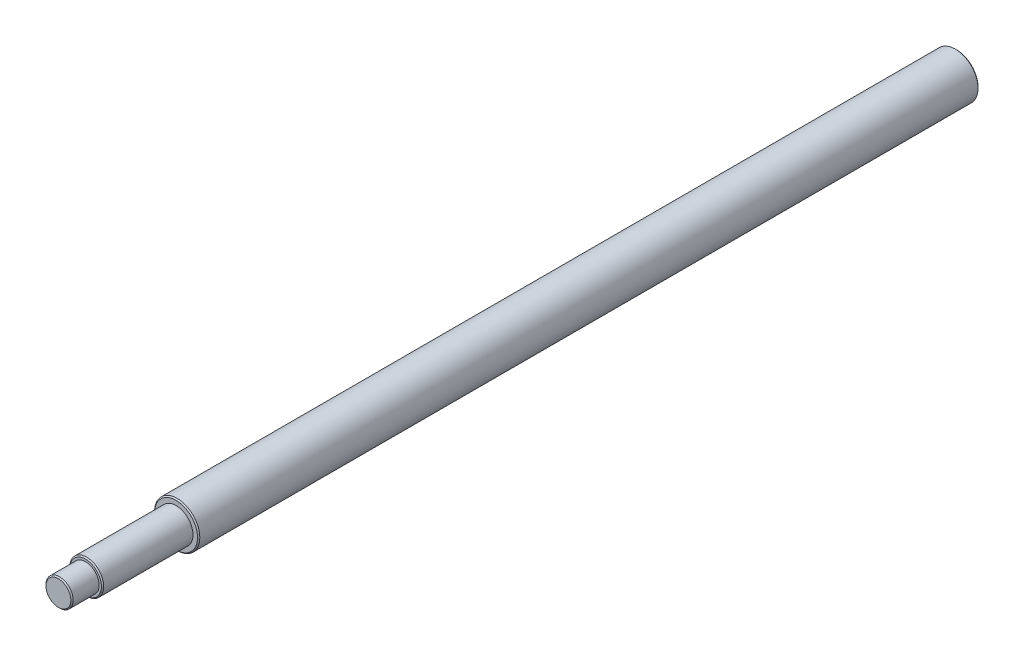
ISO-10303-21;
HEADER;
FILE_DESCRIPTION(('STEP AP214'),'2;1');
FILE_NAME('part.step','',(''),(''),'','','');
FILE_SCHEMA(('AUTOMOTIVE_DESIGN { 1 0 10303 214 1 1 1 1 }'));
ENDSEC;
DATA;
#1=APPLICATION_CONTEXT('core data for automotive mechanical design processes');
#2=APPLICATION_PROTOCOL_DEFINITION('international standard','automotive_design',2000,#1);
#3=PRODUCT_CONTEXT('',#1,'mechanical');
#4=PRODUCT('Part','Part','',(#3));
#5=PRODUCT_RELATED_PRODUCT_CATEGORY('part','',(#4));
#6=PRODUCT_DEFINITION_FORMATION('','',#4);
#7=PRODUCT_DEFINITION_CONTEXT('part definition',#1,'design');
#8=PRODUCT_DEFINITION('design','',#6,#7);
#9=PRODUCT_DEFINITION_SHAPE('','',#8);
#10=(LENGTH_UNIT() NAMED_UNIT(*) SI_UNIT(.MILLI.,.METRE.));
#11=(NAMED_UNIT(*) PLANE_ANGLE_UNIT() SI_UNIT($,.RADIAN.));
#12=(NAMED_UNIT(*) SI_UNIT($,.STERADIAN.) SOLID_ANGLE_UNIT());
#13=UNCERTAINTY_MEASURE_WITH_UNIT(LENGTH_MEASURE(1.E-05),#10,'distance_accuracy_value','');
#14=(GEOMETRIC_REPRESENTATION_CONTEXT(3) GLOBAL_UNCERTAINTY_ASSIGNED_CONTEXT((#13)) GLOBAL_UNIT_ASSIGNED_CONTEXT((#10,
#11,#12)) REPRESENTATION_CONTEXT('',''));
#15=CARTESIAN_POINT('',(0.,0.,0.));
#16=DIRECTION('',(0.,0.,1.));
#17=DIRECTION('',(1.,0.,0.));
#18=AXIS2_PLACEMENT_3D('',#15,#16,#17);
#19=CARTESIAN_POINT('',(0.,0.,212.5));
#20=DIRECTION('',(0.,0.,1.));
#21=DIRECTION('',(1.,0.,0.));
#22=AXIS2_PLACEMENT_3D('',#19,#20,#21);
#23=PLANE('',#22);
#24=CARTESIAN_POINT('',(0.,0.,212.5));
#25=DIRECTION('',(0.,0.,1.));
#26=DIRECTION('',(1.,0.,0.));
#27=AXIS2_PLACEMENT_3D('',#24,#25,#26);
#28=CIRCLE('',#27,7.00000000000006);
#29=CARTESIAN_POINT('',(7.00000000000006,0.,212.5));
#30=VERTEX_POINT('',#29);
#31=EDGE_CURVE('E47',#30,#30,#28,.T.);
#32=ORIENTED_EDGE('',*,*,#31,.T.);
#33=EDGE_LOOP('',(#32));
#34=FACE_BOUND('',#33,.T.);
#35=CARTESIAN_POINT('',(0.,0.,212.5));
#36=DIRECTION('',(0.,0.,1.));
#37=DIRECTION('',(1.,0.,0.));
#38=AXIS2_PLACEMENT_3D('',#35,#36,#37);
#39=CIRCLE('',#38,6.);
#40=CARTESIAN_POINT('',(6.,0.,212.5));
#41=VERTEX_POINT('',#40);
#42=EDGE_CURVE('E67',#41,#41,#39,.T.);
#43=ORIENTED_EDGE('',*,*,#42,.F.);
#44=EDGE_LOOP('',(#43));
#45=FACE_BOUND('',#44,.T.);
#46=ADVANCED_FACE('F32',(#34,#45),#23,.T.);
#47=CARTESIAN_POINT('',(0.,0.,172.5));
#48=DIRECTION('',(0.,0.,1.));
#49=DIRECTION('',(1.,0.,0.));
#50=AXIS2_PLACEMENT_3D('',#47,#48,#49);
#51=PLANE('',#50);
#52=CARTESIAN_POINT('',(0.,0.,172.5));
#53=DIRECTION('',(0.,0.,1.));
#54=DIRECTION('',(1.,0.,0.));
#55=AXIS2_PLACEMENT_3D('',#52,#53,#54);
#56=CIRCLE('',#55,9.50000000000001);
#57=CARTESIAN_POINT('',(9.50000000000001,0.,172.5));
#58=VERTEX_POINT('',#57);
#59=EDGE_CURVE('E52',#58,#58,#56,.T.);
#60=ORIENTED_EDGE('',*,*,#59,.T.);
#61=EDGE_LOOP('',(#60));
#62=FACE_BOUND('',#61,.T.);
#63=CARTESIAN_POINT('',(0.,0.,172.5));
#64=DIRECTION('',(0.,0.,1.));
#65=DIRECTION('',(1.,0.,0.));
#66=AXIS2_PLACEMENT_3D('',#63,#64,#65);
#67=CIRCLE('',#66,7.5);
#68=CARTESIAN_POINT('',(7.5,0.,172.5));
#69=VERTEX_POINT('',#68);
#70=EDGE_CURVE('E64',#69,#69,#67,.T.);
#71=ORIENTED_EDGE('',*,*,#70,.F.);
#72=EDGE_LOOP('',(#71));
#73=FACE_BOUND('',#72,.T.);
#74=ADVANCED_FACE('F74',(#62,#73),#51,.T.);
#75=CARTESIAN_POINT('',(0.,0.,172.5));
#76=DIRECTION('',(0.,0.,-1.));
#77=DIRECTION('',(-1.,0.,0.));
#78=AXIS2_PLACEMENT_3D('',#75,#76,#77);
#79=CYLINDRICAL_SURFACE('',#78,10.);
#80=CARTESIAN_POINT('',(0.,0.,-172.));
#81=DIRECTION('',(0.,0.,1.));
#82=DIRECTION('',(1.,0.,0.));
#83=AXIS2_PLACEMENT_3D('',#80,#81,#82);
#84=CIRCLE('',#83,10.);
#85=CARTESIAN_POINT('',(10.,0.,-172.));
#86=VERTEX_POINT('',#85);
#87=EDGE_CURVE('E58',#86,#86,#84,.T.);
#88=ORIENTED_EDGE('',*,*,#87,.T.);
#89=EDGE_LOOP('',(#88));
#90=FACE_BOUND('',#89,.T.);
#91=CARTESIAN_POINT('',(0.,0.,172.));
#92=DIRECTION('',(0.,0.,1.));
#93=DIRECTION('',(1.,0.,0.));
#94=AXIS2_PLACEMENT_3D('',#91,#92,#93);
#95=CIRCLE('',#94,10.);
#96=CARTESIAN_POINT('',(10.,0.,172.));
#97=VERTEX_POINT('',#96);
#98=EDGE_CURVE('E61',#97,#97,#95,.F.);
#99=ORIENTED_EDGE('',*,*,#98,.T.);
#100=EDGE_LOOP('',(#99));
#101=FACE_BOUND('',#100,.T.);
#102=ADVANCED_FACE('F80',(#90,#101),#79,.T.);
#103=CARTESIAN_POINT('',(0.,0.,-172.5));
#104=DIRECTION('',(0.,0.,1.));
#105=DIRECTION('',(1.,0.,0.));
#106=AXIS2_PLACEMENT_3D('',#103,#104,#105);
#107=PLANE('',#106);
#108=CARTESIAN_POINT('',(0.,0.,-172.5));
#109=DIRECTION('',(0.,0.,1.));
#110=DIRECTION('',(1.,0.,0.));
#111=AXIS2_PLACEMENT_3D('',#108,#109,#110);
#112=CIRCLE('',#111,9.50000000000012);
#113=CARTESIAN_POINT('',(9.50000000000012,0.,-172.5));
#114=VERTEX_POINT('',#113);
#115=EDGE_CURVE('E55',#114,#114,#112,.F.);
#116=ORIENTED_EDGE('',*,*,#115,.T.);
#117=EDGE_LOOP('',(#116));
#118=FACE_BOUND('',#117,.T.);
#119=ADVANCED_FACE('F88',(#118),#107,.F.);
#120=CARTESIAN_POINT('',(0.,0.,212.5));
#121=DIRECTION('',(0.,0.,-1.));
#122=DIRECTION('',(-1.,0.,0.));
#123=AXIS2_PLACEMENT_3D('',#120,#121,#122);
#124=CYLINDRICAL_SURFACE('',#123,7.5);
#125=CARTESIAN_POINT('',(0.,0.,212.));
#126=DIRECTION('',(0.,0.,1.));
#127=DIRECTION('',(1.,0.,0.));
#128=AXIS2_PLACEMENT_3D('',#125,#126,#127);
#129=CIRCLE('',#128,7.5);
#130=CARTESIAN_POINT('',(7.5,0.,212.));
#131=VERTEX_POINT('',#130);
#132=EDGE_CURVE('E43',#131,#131,#129,.F.);
#133=ORIENTED_EDGE('',*,*,#132,.T.);
#134=EDGE_LOOP('',(#133));
#135=FACE_BOUND('',#134,.T.);
#136=ORIENTED_EDGE('',*,*,#70,.T.);
#137=EDGE_LOOP('',(#136));
#138=FACE_BOUND('',#137,.T.);
#139=ADVANCED_FACE('F86',(#135,#138),#124,.T.);
#140=CARTESIAN_POINT('',(0.,0.,224.5));
#141=DIRECTION('',(0.,0.,-1.));
#142=DIRECTION('',(-1.,0.,0.));
#143=AXIS2_PLACEMENT_3D('',#140,#141,#142);
#144=CYLINDRICAL_SURFACE('',#143,6.);
#145=CARTESIAN_POINT('',(0.,0.,224.));
#146=DIRECTION('',(0.,0.,1.));
#147=DIRECTION('',(1.,0.,0.));
#148=AXIS2_PLACEMENT_3D('',#145,#146,#147);
#149=CIRCLE('',#148,6.);
#150=CARTESIAN_POINT('',(6.,0.,224.));
#151=VERTEX_POINT('',#150);
#152=EDGE_CURVE('E10',#151,#151,#149,.F.);
#153=ORIENTED_EDGE('',*,*,#152,.T.);
#154=EDGE_LOOP('',(#153));
#155=FACE_BOUND('',#154,.T.);
#156=ORIENTED_EDGE('',*,*,#42,.T.);
#157=EDGE_LOOP('',(#156));
#158=FACE_BOUND('',#157,.T.);
#159=ADVANCED_FACE('F71',(#155,#158),#144,.T.);
#160=CARTESIAN_POINT('',(0.,0.,224.5));
#161=DIRECTION('',(0.,0.,1.));
#162=DIRECTION('',(1.,0.,0.));
#163=AXIS2_PLACEMENT_3D('',#160,#161,#162);
#164=PLANE('',#163);
#165=CARTESIAN_POINT('',(0.,0.,224.5));
#166=DIRECTION('',(0.,0.,1.));
#167=DIRECTION('',(1.,0.,0.));
#168=AXIS2_PLACEMENT_3D('',#165,#166,#167);
#169=CIRCLE('',#168,5.49999999999995);
#170=CARTESIAN_POINT('',(5.49999999999995,0.,224.5));
#171=VERTEX_POINT('',#170);
#172=EDGE_CURVE('E39',#171,#171,#169,.T.);
#173=ORIENTED_EDGE('',*,*,#172,.T.);
#174=EDGE_LOOP('',(#173));
#175=FACE_BOUND('',#174,.T.);
#176=ADVANCED_FACE('F101',(#175),#164,.T.);
#177=CARTESIAN_POINT('',(0.,0.,-172.));
#178=DIRECTION('',(0.,0.,1.));
#179=DIRECTION('',(1.,0.,0.));
#180=AXIS2_PLACEMENT_3D('',#177,#178,#179);
#181=CONICAL_SURFACE('',#180,10.,0.785398163397384);
#182=ORIENTED_EDGE('',*,*,#115,.F.);
#183=EDGE_LOOP('',(#182));
#184=FACE_BOUND('',#183,.T.);
#185=ORIENTED_EDGE('',*,*,#87,.F.);
#186=EDGE_LOOP('',(#185));
#187=FACE_BOUND('',#186,.T.);
#188=ADVANCED_FACE('F97',(#184,#187),#181,.T.);
#189=CARTESIAN_POINT('',(0.,0.,172.5));
#190=DIRECTION('',(0.,0.,-1.));
#191=DIRECTION('',(-1.,0.,0.));
#192=AXIS2_PLACEMENT_3D('',#189,#190,#191);
#193=CONICAL_SURFACE('',#192,9.50000000000001,0.785398163397412);
#194=ORIENTED_EDGE('',*,*,#98,.F.);
#195=EDGE_LOOP('',(#194));
#196=FACE_BOUND('',#195,.T.);
#197=ORIENTED_EDGE('',*,*,#59,.F.);
#198=EDGE_LOOP('',(#197));
#199=FACE_BOUND('',#198,.T.);
#200=ADVANCED_FACE('F100',(#196,#199),#193,.T.);
#201=CARTESIAN_POINT('',(0.,0.,212.5));
#202=DIRECTION('',(0.,0.,-1.));
#203=DIRECTION('',(-1.,0.,0.));
#204=AXIS2_PLACEMENT_3D('',#201,#202,#203);
#205=CONICAL_SURFACE('',#204,7.00000000000006,0.785398163397415);
#206=ORIENTED_EDGE('',*,*,#132,.F.);
#207=EDGE_LOOP('',(#206));
#208=FACE_BOUND('',#207,.T.);
#209=ORIENTED_EDGE('',*,*,#31,.F.);
#210=EDGE_LOOP('',(#209));
#211=FACE_BOUND('',#210,.T.);
#212=ADVANCED_FACE('F104',(#208,#211),#205,.T.);
#213=CARTESIAN_POINT('',(0.,0.,224.5));
#214=DIRECTION('',(0.,0.,-1.));
#215=DIRECTION('',(-1.,0.,0.));
#216=AXIS2_PLACEMENT_3D('',#213,#214,#215);
#217=CONICAL_SURFACE('',#216,5.49999999999995,0.785398163397472);
#218=ORIENTED_EDGE('',*,*,#152,.F.);
#219=EDGE_LOOP('',(#218));
#220=FACE_BOUND('',#219,.T.);
#221=ORIENTED_EDGE('',*,*,#172,.F.);
#222=EDGE_LOOP('',(#221));
#223=FACE_BOUND('',#222,.T.);
#224=ADVANCED_FACE('F34',(#220,#223),#217,.T.);
#225=CLOSED_SHELL('',(#46,#74,#102,#119,#139,#159,#176,#188,#200,#212,#224));
#226=MANIFOLD_SOLID_BREP('B2',#225);
#227=ADVANCED_BREP_SHAPE_REPRESENTATION('',(#18,#226),#14);
#228=SHAPE_DEFINITION_REPRESENTATION(#9,#227);
ENDSEC;
END-ISO-10303-21;
